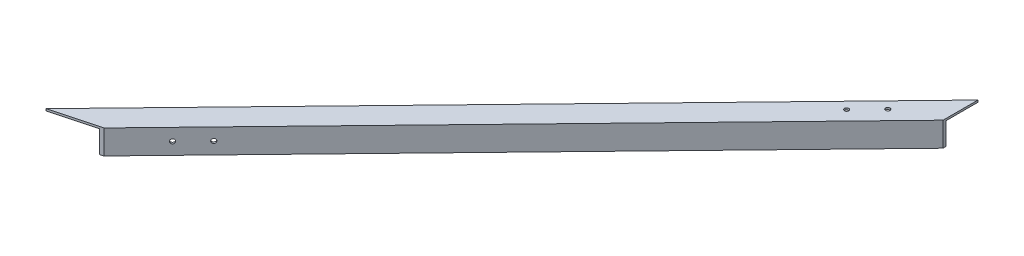
ISO-10303-21;
HEADER;
FILE_DESCRIPTION(('STEP AP214'),'2;1');
FILE_NAME('part.step','',(''),(''),'','','');
FILE_SCHEMA(('AUTOMOTIVE_DESIGN { 1 0 10303 214 1 1 1 1 }'));
ENDSEC;
DATA;
#1=APPLICATION_CONTEXT('core data for automotive mechanical design processes');
#2=APPLICATION_PROTOCOL_DEFINITION('international standard','automotive_design',2000,#1);
#3=PRODUCT_CONTEXT('',#1,'mechanical');
#4=PRODUCT('Part','Part','',(#3));
#5=PRODUCT_RELATED_PRODUCT_CATEGORY('part','',(#4));
#6=PRODUCT_DEFINITION_FORMATION('','',#4);
#7=PRODUCT_DEFINITION_CONTEXT('part definition',#1,'design');
#8=PRODUCT_DEFINITION('design','',#6,#7);
#9=PRODUCT_DEFINITION_SHAPE('','',#8);
#10=(LENGTH_UNIT() NAMED_UNIT(*) SI_UNIT(.MILLI.,.METRE.));
#11=(NAMED_UNIT(*) PLANE_ANGLE_UNIT() SI_UNIT($,.RADIAN.));
#12=(NAMED_UNIT(*) SI_UNIT($,.STERADIAN.) SOLID_ANGLE_UNIT());
#13=UNCERTAINTY_MEASURE_WITH_UNIT(LENGTH_MEASURE(1.E-05),#10,'distance_accuracy_value','');
#14=(GEOMETRIC_REPRESENTATION_CONTEXT(3) GLOBAL_UNCERTAINTY_ASSIGNED_CONTEXT((#13)) GLOBAL_UNIT_ASSIGNED_CONTEXT((#10,
#11,#12)) REPRESENTATION_CONTEXT('',''));
#15=CARTESIAN_POINT('',(0.,0.,0.));
#16=DIRECTION('',(0.,0.,1.));
#17=DIRECTION('',(1.,0.,0.));
#18=AXIS2_PLACEMENT_3D('',#15,#16,#17);
#19=CARTESIAN_POINT('',(-126.4854181126,2020.9,1968.975524279));
#20=DIRECTION('',(0.,-1.,0.));
#21=DIRECTION('',(-0.69565718102514,0.,0.718373918296145));
#22=AXIS2_PLACEMENT_3D('',#19,#20,#21);
#23=CYLINDRICAL_SURFACE('',#22,4.5);
#24=CARTESIAN_POINT('',(-126.4854181126,2021.,1968.975524279));
#25=DIRECTION('',(0.,-1.,0.));
#26=DIRECTION('',(-0.69565718102514,0.,0.718373918296145));
#27=AXIS2_PLACEMENT_3D('',#24,#25,#26);
#28=CIRCLE('',#27,4.5);
#29=CARTESIAN_POINT('',(-129.6158754272,2021.,1972.208206911));
#30=VERTEX_POINT('',#29);
#31=EDGE_CURVE('E176',#30,#30,#28,.T.);
#32=ORIENTED_EDGE('',*,*,#31,.T.);
#33=DIRECTION('',(0.,1.,0.));
#34=VECTOR('',#33,1.);
#35=CARTESIAN_POINT('',(-129.6158754272,2020.9,1972.208206911));
#36=LINE('',#35,#34);
#37=CARTESIAN_POINT('',(-129.6158754272,2025.,1972.208206911));
#38=VERTEX_POINT('',#37);
#39=EDGE_CURVE('E11',#30,#38,#36,.T.);
#40=ORIENTED_EDGE('',*,*,#39,.T.);
#41=CARTESIAN_POINT('',(-126.4854181126,2025.,1968.975524279));
#42=DIRECTION('',(0.,-1.,0.));
#43=DIRECTION('',(-0.69565718102514,0.,0.718373918296145));
#44=AXIS2_PLACEMENT_3D('',#41,#42,#43);
#45=CIRCLE('',#44,4.5);
#46=EDGE_CURVE('E156',#38,#38,#45,.T.);
#47=ORIENTED_EDGE('',*,*,#46,.F.);
#48=ORIENTED_EDGE('',*,*,#39,.F.);
#49=EDGE_LOOP('',(#32,#40,#47,#48));
#50=FACE_BOUND('',#49,.T.);
#51=ADVANCED_FACE('F17',(#50),#23,.F.);
#52=CARTESIAN_POINT('',(-168.2248489741,2020.9,2012.077959377));
#53=DIRECTION('',(0.,-1.,0.));
#54=DIRECTION('',(-0.69565718102514,0.,0.718373918296145));
#55=AXIS2_PLACEMENT_3D('',#52,#53,#54);
#56=CYLINDRICAL_SURFACE('',#55,4.5);
#57=CARTESIAN_POINT('',(-168.2248489741,2021.,2012.077959377));
#58=DIRECTION('',(0.,-1.,0.));
#59=DIRECTION('',(-0.69565718102514,0.,0.718373918296145));
#60=AXIS2_PLACEMENT_3D('',#57,#58,#59);
#61=CIRCLE('',#60,4.5);
#62=CARTESIAN_POINT('',(-171.3553062887,2021.,2015.310642009));
#63=VERTEX_POINT('',#62);
#64=EDGE_CURVE('E179',#63,#63,#61,.T.);
#65=ORIENTED_EDGE('',*,*,#64,.T.);
#66=DIRECTION('',(0.,1.,0.));
#67=VECTOR('',#66,1.);
#68=CARTESIAN_POINT('',(-171.3553062887,2020.9,2015.310642009));
#69=LINE('',#68,#67);
#70=CARTESIAN_POINT('',(-171.3553062887,2025.,2015.310642009));
#71=VERTEX_POINT('',#70);
#72=EDGE_CURVE('E25',#63,#71,#69,.T.);
#73=ORIENTED_EDGE('',*,*,#72,.T.);
#74=CARTESIAN_POINT('',(-168.2248489741,2025.,2012.077959377));
#75=DIRECTION('',(0.,-1.,0.));
#76=DIRECTION('',(-0.69565718102514,0.,0.718373918296145));
#77=AXIS2_PLACEMENT_3D('',#74,#75,#76);
#78=CIRCLE('',#77,4.5);
#79=EDGE_CURVE('E161',#71,#71,#78,.T.);
#80=ORIENTED_EDGE('',*,*,#79,.F.);
#81=ORIENTED_EDGE('',*,*,#72,.F.);
#82=EDGE_LOOP('',(#65,#73,#80,#81));
#83=FACE_BOUND('',#82,.T.);
#84=ADVANCED_FACE('F232',(#83),#56,.F.);
#85=CARTESIAN_POINT('',(42.85387123988,2021.,1763.919165048));
#86=DIRECTION('',(-0.718373918296145,0.,-0.69565718102514));
#87=DIRECTION('',(-0.69565718102514,0.,0.718373918296145));
#88=AXIS2_PLACEMENT_3D('',#85,#86,#87);
#89=PLANE('',#88);
#90=DIRECTION('',(0.,1.,0.));
#91=VECTOR('',#90,1.);
#92=CARTESIAN_POINT('',(-50.,2010.5,1859.805186398));
#93=LINE('',#92,#91);
#94=CARTESIAN_POINT('',(-50.,2021.,1859.805186398));
#95=VERTEX_POINT('',#94);
#96=CARTESIAN_POINT('',(-50.,2025.,1859.805186398));
#97=VERTEX_POINT('',#96);
#98=EDGE_CURVE('E126',#95,#97,#93,.T.);
#99=ORIENTED_EDGE('',*,*,#98,.F.);
#100=DIRECTION('',(-0.69565718102514,0.,0.718373918296145));
#101=VECTOR('',#100,1.);
#102=CARTESIAN_POINT('',(42.85387123988,2021.,1763.919165048));
#103=LINE('',#102,#101);
#104=CARTESIAN_POINT('',(-993.9897081034,2021.,2834.620949014));
#105=VERTEX_POINT('',#104);
#106=EDGE_CURVE('E226',#95,#105,#103,.T.);
#107=ORIENTED_EDGE('',*,*,#106,.T.);
#108=DIRECTION('',(0.,-1.,0.));
#109=VECTOR('',#108,1.);
#110=CARTESIAN_POINT('',(-993.9897081034,1010.5,2834.620949014));
#111=LINE('',#110,#109);
#112=CARTESIAN_POINT('',(-993.9897081034,2025.,2834.620949014));
#113=VERTEX_POINT('',#112);
#114=EDGE_CURVE('E183',#113,#105,#111,.T.);
#115=ORIENTED_EDGE('',*,*,#114,.F.);
#116=DIRECTION('',(-0.69565718102514,0.,0.718373918296145));
#117=VECTOR('',#116,1.);
#118=CARTESIAN_POINT('',(42.85387123988,2025.,1763.919165048));
#119=LINE('',#118,#117);
#120=EDGE_CURVE('E130',#97,#113,#119,.T.);
#121=ORIENTED_EDGE('',*,*,#120,.F.);
#122=EDGE_LOOP('',(#99,#107,#115,#121));
#123=FACE_BOUND('',#122,.T.);
#124=ADVANCED_FACE('F255',(#123),#89,.T.);
#125=CARTESIAN_POINT('',(75.899071481491,2021.,1795.919395375));
#126=DIRECTION('',(0.,-1.,0.));
#127=DIRECTION('',(0.,0.,-1.));
#128=AXIS2_PLACEMENT_3D('',#125,#126,#127);
#129=PLANE('',#128);
#130=ORIENTED_EDGE('',*,*,#31,.F.);
#131=EDGE_LOOP('',(#130));
#132=FACE_BOUND('',#131,.T.);
#133=ORIENTED_EDGE('',*,*,#64,.F.);
#134=EDGE_LOOP('',(#133));
#135=FACE_BOUND('',#134,.T.);
#136=DIRECTION('',(0.,0.,-1.));
#137=VECTOR('',#136,1.);
#138=CARTESIAN_POINT('',(-50.,2021.,1863.79953222));
#139=LINE('',#138,#137);
#140=CARTESIAN_POINT('',(-50.,2021.,1925.929710451));
#141=VERTEX_POINT('',#140);
#142=EDGE_CURVE('E175',#141,#95,#139,.T.);
#143=ORIENTED_EDGE('',*,*,#142,.F.);
#144=DIRECTION('',(-0.69565718102514,0.,0.718373918296145));
#145=VECTOR('',#144,1.);
#146=CARTESIAN_POINT('',(75.899071481491,2021.,1795.919395375));
#147=LINE('',#146,#145);
#148=CARTESIAN_POINT('',(-907.5191766482,2021.,2811.451239942));
#149=VERTEX_POINT('',#148);
#150=EDGE_CURVE('E223',#141,#149,#147,.T.);
#151=ORIENTED_EDGE('',*,*,#150,.T.);
#152=DIRECTION('',(0.965925826288944,0.,-0.258819045102985));
#153=VECTOR('',#152,1.);
#154=CARTESIAN_POINT('',(108.59433181499,2021.,2539.184445931));
#155=LINE('',#154,#153);
#156=EDGE_CURVE('E202',#105,#149,#155,.T.);
#157=ORIENTED_EDGE('',*,*,#156,.F.);
#158=ORIENTED_EDGE('',*,*,#106,.F.);
#159=EDGE_LOOP('',(#143,#151,#157,#158));
#160=FACE_BOUND('',#159,.T.);
#161=ADVANCED_FACE('F258',(#132,#135,#160),#129,.T.);
#162=CARTESIAN_POINT('',(75.899071481491,1975.,1795.919395375));
#163=DIRECTION('',(-0.718373918296145,0.,-0.69565718102514));
#164=DIRECTION('',(-0.69565718102514,0.,0.718373918296145));
#165=AXIS2_PLACEMENT_3D('',#162,#163,#164);
#166=PLANE('',#165);
#167=CARTESIAN_POINT('',(-791.5683467091,2000.,2691.71402698));
#168=DIRECTION('',(-0.718373918296144,0.,-0.69565718102514));
#169=DIRECTION('',(-0.69565718102514,0.,0.718373918296145));
#170=AXIS2_PLACEMENT_3D('',#167,#168,#169);
#171=CIRCLE('',#170,4.5);
#172=CARTESIAN_POINT('',(-794.6988040237,2000.,2694.946709612));
#173=VERTEX_POINT('',#172);
#174=EDGE_CURVE('E216',#173,#173,#171,.T.);
#175=ORIENTED_EDGE('',*,*,#174,.F.);
#176=EDGE_LOOP('',(#175));
#177=FACE_BOUND('',#176,.T.);
#178=CARTESIAN_POINT('',(-833.3077775706,2000.,2734.816462078));
#179=DIRECTION('',(-0.718373918296144,0.,-0.69565718102514));
#180=DIRECTION('',(-0.69565718102514,0.,0.718373918296145));
#181=AXIS2_PLACEMENT_3D('',#178,#179,#180);
#182=CIRCLE('',#181,4.5);
#183=CARTESIAN_POINT('',(-836.4382348852,2000.,2738.04914471));
#184=VERTEX_POINT('',#183);
#185=EDGE_CURVE('E209',#184,#184,#182,.T.);
#186=ORIENTED_EDGE('',*,*,#185,.F.);
#187=EDGE_LOOP('',(#186));
#188=FACE_BOUND('',#187,.T.);
#189=DIRECTION('',(0.,1.,0.));
#190=VECTOR('',#189,1.);
#191=CARTESIAN_POINT('',(-50.,1987.5,1925.929710451));
#192=LINE('',#191,#190);
#193=CARTESIAN_POINT('',(-50.,1975.,1925.929710451));
#194=VERTEX_POINT('',#193);
#195=EDGE_CURVE('E186',#194,#141,#192,.T.);
#196=ORIENTED_EDGE('',*,*,#195,.F.);
#197=DIRECTION('',(-0.69565718102514,0.,0.718373918296145));
#198=VECTOR('',#197,1.);
#199=CARTESIAN_POINT('',(75.899071481491,1975.,1795.919395375));
#200=LINE('',#199,#198);
#201=CARTESIAN_POINT('',(-907.5191766482,1975.,2811.451239942));
#202=VERTEX_POINT('',#201);
#203=EDGE_CURVE('E155',#194,#202,#200,.T.);
#204=ORIENTED_EDGE('',*,*,#203,.T.);
#205=DIRECTION('',(0.,-1.,0.));
#206=VECTOR('',#205,1.);
#207=CARTESIAN_POINT('',(-907.5191766482,987.5,2811.451239942));
#208=LINE('',#207,#206);
#209=EDGE_CURVE('E206',#149,#202,#208,.T.);
#210=ORIENTED_EDGE('',*,*,#209,.F.);
#211=ORIENTED_EDGE('',*,*,#150,.F.);
#212=EDGE_LOOP('',(#196,#204,#210,#211));
#213=FACE_BOUND('',#212,.T.);
#214=ADVANCED_FACE('F261',(#177,#188,#213),#166,.T.);
#215=CARTESIAN_POINT('',(-791.6401841009,2000.,2691.644461262));
#216=DIRECTION('',(-0.718373918296144,0.,-0.69565718102514));
#217=DIRECTION('',(-0.69565718102514,0.,0.718373918296145));
#218=AXIS2_PLACEMENT_3D('',#215,#216,#217);
#219=CYLINDRICAL_SURFACE('',#218,4.5);
#220=ORIENTED_EDGE('',*,*,#174,.T.);
#221=DIRECTION('',(0.718373918296145,0.,0.69565718102514));
#222=VECTOR('',#221,1.);
#223=CARTESIAN_POINT('',(-794.7706414155,2000.,2694.877143894));
#224=LINE('',#223,#222);
#225=CARTESIAN_POINT('',(-791.8253083505,2000.,2697.729338336));
#226=VERTEX_POINT('',#225);
#227=EDGE_CURVE('E220',#173,#226,#224,.T.);
#228=ORIENTED_EDGE('',*,*,#227,.T.);
#229=CARTESIAN_POINT('',(-788.6948510359,2000.,2694.496655704));
#230=DIRECTION('',(-0.718373918296144,0.,-0.69565718102514));
#231=DIRECTION('',(-0.69565718102514,0.,0.718373918296145));
#232=AXIS2_PLACEMENT_3D('',#229,#230,#231);
#233=CIRCLE('',#232,4.5);
#234=EDGE_CURVE('E168',#226,#226,#233,.T.);
#235=ORIENTED_EDGE('',*,*,#234,.F.);
#236=ORIENTED_EDGE('',*,*,#227,.F.);
#237=EDGE_LOOP('',(#220,#228,#235,#236));
#238=FACE_BOUND('',#237,.T.);
#239=ADVANCED_FACE('F281',(#238),#219,.F.);
#240=CARTESIAN_POINT('',(-833.3796149624,2000.,2734.74689636));
#241=DIRECTION('',(-0.718373918296144,0.,-0.69565718102514));
#242=DIRECTION('',(-0.69565718102514,0.,0.718373918296145));
#243=AXIS2_PLACEMENT_3D('',#240,#241,#242);
#244=CYLINDRICAL_SURFACE('',#243,4.5);
#245=ORIENTED_EDGE('',*,*,#185,.T.);
#246=DIRECTION('',(0.718373918296145,0.,0.69565718102514));
#247=VECTOR('',#246,1.);
#248=CARTESIAN_POINT('',(-836.510072277,2000.,2737.979578992));
#249=LINE('',#248,#247);
#250=CARTESIAN_POINT('',(-833.564739212,2000.,2740.831773434));
#251=VERTEX_POINT('',#250);
#252=EDGE_CURVE('E213',#184,#251,#249,.T.);
#253=ORIENTED_EDGE('',*,*,#252,.T.);
#254=CARTESIAN_POINT('',(-830.4342818974,2000.,2737.599090802));
#255=DIRECTION('',(-0.718373918296144,0.,-0.69565718102514));
#256=DIRECTION('',(-0.69565718102514,0.,0.718373918296145));
#257=AXIS2_PLACEMENT_3D('',#254,#255,#256);
#258=CIRCLE('',#257,4.5);
#259=EDGE_CURVE('E164',#251,#251,#258,.T.);
#260=ORIENTED_EDGE('',*,*,#259,.F.);
#261=ORIENTED_EDGE('',*,*,#252,.F.);
#262=EDGE_LOOP('',(#245,#253,#260,#261));
#263=FACE_BOUND('',#262,.T.);
#264=ADVANCED_FACE('F278',(#263),#244,.F.);
#265=CARTESIAN_POINT('',(-46.716837641,0.,2580.799948362));
#266=DIRECTION('',(-0.258819045102985,0.,-0.965925826288944));
#267=DIRECTION('',(-0.965925826288944,0.,0.258819045102985));
#268=AXIS2_PLACEMENT_3D('',#265,#266,#267);
#269=PLANE('',#268);
#270=DIRECTION('',(-0.965925826288944,0.,0.258819045102985));
#271=VECTOR('',#270,1.);
#272=CARTESIAN_POINT('',(97.178564824898,2025.,2542.243291477));
#273=LINE('',#272,#271);
#274=CARTESIAN_POINT('',(-900.,2025.,2809.436482631));
#275=VERTEX_POINT('',#274);
#276=EDGE_CURVE('E136',#275,#113,#273,.T.);
#277=ORIENTED_EDGE('',*,*,#276,.T.);
#278=ORIENTED_EDGE('',*,*,#114,.T.);
#279=ORIENTED_EDGE('',*,*,#156,.T.);
#280=ORIENTED_EDGE('',*,*,#209,.T.);
#281=DIRECTION('',(0.965925826288944,0.,-0.258819045102985));
#282=VECTOR('',#281,1.);
#283=CARTESIAN_POINT('',(109.58700720544,1975.,2538.918459362));
#284=LINE('',#283,#282);
#285=CARTESIAN_POINT('',(-900.,1975.,2809.436482631));
#286=VERTEX_POINT('',#285);
#287=EDGE_CURVE('E153',#202,#286,#284,.T.);
#288=ORIENTED_EDGE('',*,*,#287,.T.);
#289=DIRECTION('',(0.,1.,0.));
#290=VECTOR('',#289,1.);
#291=CARTESIAN_POINT('',(-900.,1012.5,2809.436482631));
#292=LINE('',#291,#290);
#293=EDGE_CURVE('E141',#286,#275,#292,.T.);
#294=ORIENTED_EDGE('',*,*,#293,.T.);
#295=EDGE_LOOP('',(#277,#278,#279,#280,#288,#294));
#296=FACE_BOUND('',#295,.T.);
#297=ADVANCED_FACE('F246',(#296),#269,.F.);
#298=CARTESIAN_POINT('',(78.772567154674,1975.,1798.7020241));
#299=DIRECTION('',(0.,-1.,0.));
#300=DIRECTION('',(0.,0.,-1.));
#301=AXIS2_PLACEMENT_3D('',#298,#299,#300);
#302=PLANE('',#301);
#303=DIRECTION('',(0.,0.,-1.));
#304=VECTOR('',#303,1.);
#305=CARTESIAN_POINT('',(-50.,1975.,1865.190846582));
#306=LINE('',#305,#304);
#307=CARTESIAN_POINT('',(-50.,1975.,1931.679669065));
#308=VERTEX_POINT('',#307);
#309=EDGE_CURVE('E172',#308,#194,#306,.T.);
#310=ORIENTED_EDGE('',*,*,#309,.F.);
#311=DIRECTION('',(-0.69565718102514,0.,0.718373918296145));
#312=VECTOR('',#311,1.);
#313=CARTESIAN_POINT('',(78.772567154674,1975.,1798.7020241));
#314=LINE('',#313,#312);
#315=EDGE_CURVE('E146',#308,#286,#314,.T.);
#316=ORIENTED_EDGE('',*,*,#315,.T.);
#317=ORIENTED_EDGE('',*,*,#287,.F.);
#318=ORIENTED_EDGE('',*,*,#203,.F.);
#319=EDGE_LOOP('',(#310,#316,#317,#318));
#320=FACE_BOUND('',#319,.T.);
#321=ADVANCED_FACE('F236',(#320),#302,.T.);
#322=CARTESIAN_POINT('',(42.85387123988,2025.,1763.919165048));
#323=DIRECTION('',(0.,1.,0.));
#324=DIRECTION('',(1.,0.,0.));
#325=AXIS2_PLACEMENT_3D('',#322,#323,#324);
#326=PLANE('',#325);
#327=ORIENTED_EDGE('',*,*,#46,.T.);
#328=EDGE_LOOP('',(#327));
#329=FACE_BOUND('',#328,.T.);
#330=ORIENTED_EDGE('',*,*,#79,.T.);
#331=EDGE_LOOP('',(#330));
#332=FACE_BOUND('',#331,.T.);
#333=DIRECTION('',(0.,0.,1.));
#334=VECTOR('',#333,1.);
#335=CARTESIAN_POINT('',(-50.,2025.,1847.799417057));
#336=LINE('',#335,#334);
#337=CARTESIAN_POINT('',(-50.,2025.,1931.679669065));
#338=VERTEX_POINT('',#337);
#339=EDGE_CURVE('E118',#97,#338,#336,.T.);
#340=ORIENTED_EDGE('',*,*,#339,.F.);
#341=ORIENTED_EDGE('',*,*,#120,.T.);
#342=ORIENTED_EDGE('',*,*,#276,.F.);
#343=DIRECTION('',(-0.69565718102514,0.,0.718373918296145));
#344=VECTOR('',#343,1.);
#345=CARTESIAN_POINT('',(78.772567154674,2025.,1798.7020241));
#346=LINE('',#345,#344);
#347=EDGE_CURVE('E133',#338,#275,#346,.T.);
#348=ORIENTED_EDGE('',*,*,#347,.F.);
#349=EDGE_LOOP('',(#340,#341,#342,#348));
#350=FACE_BOUND('',#349,.T.);
#351=ADVANCED_FACE('F134',(#329,#332,#350),#326,.T.);
#352=CARTESIAN_POINT('',(-50.,2000.,1931.679669065));
#353=DIRECTION('',(-1.,0.,0.));
#354=DIRECTION('',(0.,0.,1.));
#355=AXIS2_PLACEMENT_3D('',#352,#353,#354);
#356=PLANE('',#355);
#357=ORIENTED_EDGE('',*,*,#309,.T.);
#358=ORIENTED_EDGE('',*,*,#195,.T.);
#359=ORIENTED_EDGE('',*,*,#142,.T.);
#360=ORIENTED_EDGE('',*,*,#98,.T.);
#361=ORIENTED_EDGE('',*,*,#339,.T.);
#362=DIRECTION('',(0.,-1.,0.));
#363=VECTOR('',#362,1.);
#364=CARTESIAN_POINT('',(-50.,2012.5,1931.679669065));
#365=LINE('',#364,#363);
#366=EDGE_CURVE('E123',#338,#308,#365,.T.);
#367=ORIENTED_EDGE('',*,*,#366,.T.);
#368=EDGE_LOOP('',(#357,#358,#359,#360,#361,#367));
#369=FACE_BOUND('',#368,.T.);
#370=ADVANCED_FACE('F121',(#369),#356,.F.);
#371=CARTESIAN_POINT('',(78.772567154674,2025.,1798.7020241));
#372=DIRECTION('',(0.718373918296145,0.,0.69565718102514));
#373=DIRECTION('',(0.,-1.,0.));
#374=AXIS2_PLACEMENT_3D('',#371,#372,#373);
#375=PLANE('',#374);
#376=ORIENTED_EDGE('',*,*,#234,.T.);
#377=EDGE_LOOP('',(#376));
#378=FACE_BOUND('',#377,.T.);
#379=ORIENTED_EDGE('',*,*,#259,.T.);
#380=EDGE_LOOP('',(#379));
#381=FACE_BOUND('',#380,.T.);
#382=ORIENTED_EDGE('',*,*,#366,.F.);
#383=ORIENTED_EDGE('',*,*,#347,.T.);
#384=ORIENTED_EDGE('',*,*,#293,.F.);
#385=ORIENTED_EDGE('',*,*,#315,.F.);
#386=EDGE_LOOP('',(#382,#383,#384,#385));
#387=FACE_BOUND('',#386,.T.);
#388=ADVANCED_FACE('F144',(#378,#381,#387),#375,.T.);
#389=CLOSED_SHELL('',(#51,#84,#124,#161,#214,#239,#264,#297,#321,#351,#370,#388));
#390=MANIFOLD_SOLID_BREP('B1',#389);
#391=ADVANCED_BREP_SHAPE_REPRESENTATION('',(#18,#390),#14);
#392=SHAPE_DEFINITION_REPRESENTATION(#9,#391);
ENDSEC;
END-ISO-10303-21;
